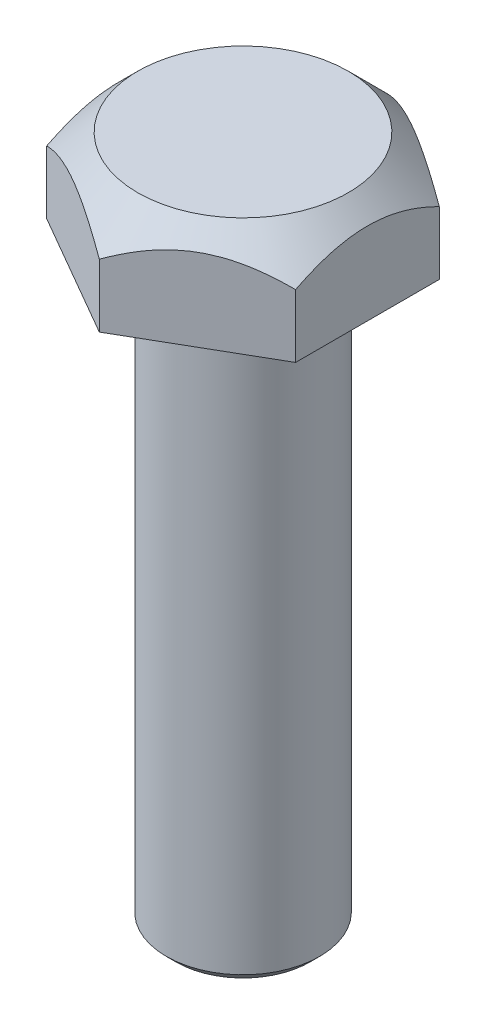
ISO-10303-21;
HEADER;
FILE_DESCRIPTION(('STEP AP214'),'2;1');
FILE_NAME('part.step','',(''),(''),'','','');
FILE_SCHEMA(('AUTOMOTIVE_DESIGN { 1 0 10303 214 1 1 1 1 }'));
ENDSEC;
DATA;
#1=APPLICATION_CONTEXT('core data for automotive mechanical design processes');
#2=APPLICATION_PROTOCOL_DEFINITION('international standard','automotive_design',2000,#1);
#3=PRODUCT_CONTEXT('',#1,'mechanical');
#4=PRODUCT('Part','Part','',(#3));
#5=PRODUCT_RELATED_PRODUCT_CATEGORY('part','',(#4));
#6=PRODUCT_DEFINITION_FORMATION('','',#4);
#7=PRODUCT_DEFINITION_CONTEXT('part definition',#1,'design');
#8=PRODUCT_DEFINITION('design','',#6,#7);
#9=PRODUCT_DEFINITION_SHAPE('','',#8);
#10=(LENGTH_UNIT() NAMED_UNIT(*) SI_UNIT(.MILLI.,.METRE.));
#11=(NAMED_UNIT(*) PLANE_ANGLE_UNIT() SI_UNIT($,.RADIAN.));
#12=(NAMED_UNIT(*) SI_UNIT($,.STERADIAN.) SOLID_ANGLE_UNIT());
#13=UNCERTAINTY_MEASURE_WITH_UNIT(LENGTH_MEASURE(1.E-05),#10,'distance_accuracy_value','');
#14=(GEOMETRIC_REPRESENTATION_CONTEXT(3) GLOBAL_UNCERTAINTY_ASSIGNED_CONTEXT((#13)) GLOBAL_UNIT_ASSIGNED_CONTEXT((#10,
#11,#12)) REPRESENTATION_CONTEXT('',''));
#15=CARTESIAN_POINT('',(0.,0.,0.));
#16=DIRECTION('',(0.,0.,1.));
#17=DIRECTION('',(1.,0.,0.));
#18=AXIS2_PLACEMENT_3D('',#15,#16,#17);
#19=CARTESIAN_POINT('',(6.49999999999999,5.3,-3.75277674973258));
#20=DIRECTION('',(-0.5,0.,0.866025403784439));
#21=DIRECTION('',(0.866025403784439,0.,0.5));
#22=AXIS2_PLACEMENT_3D('',#19,#20,#21);
#23=PLANE('',#22);
#24=DIRECTION('',(-0.866025403784439,0.,-0.5));
#25=VECTOR('',#24,1.);
#26=CARTESIAN_POINT('',(6.49999999999999,3.3,-3.75277674973258));
#27=LINE('',#26,#25);
#28=CARTESIAN_POINT('',(6.49999999999999,3.3,-3.75277674973258));
#29=VERTEX_POINT('',#28);
#30=CARTESIAN_POINT('',(6.49037034920394,3.3,-3.75833643121188));
#31=VERTEX_POINT('',#30);
#32=EDGE_CURVE('E234',#29,#31,#27,.T.);
#33=ORIENTED_EDGE('',*,*,#32,.F.);
#34=DIRECTION('',(0.,-1.,0.));
#35=VECTOR('',#34,1.);
#36=CARTESIAN_POINT('',(6.49999999999999,5.3,-3.75277674973258));
#37=LINE('',#36,#35);
#38=CARTESIAN_POINT('',(6.49999999999999,0.,-3.75277674973258));
#39=VERTEX_POINT('',#38);
#40=EDGE_CURVE('E70',#29,#39,#37,.T.);
#41=ORIENTED_EDGE('',*,*,#40,.T.);
#42=DIRECTION('',(-0.866025403784439,0.,-0.5));
#43=VECTOR('',#42,1.);
#44=CARTESIAN_POINT('',(6.49999999999999,0.,-3.75277674973258));
#45=LINE('',#44,#43);
#46=CARTESIAN_POINT('',(0.,0.,-7.50555349946514));
#47=VERTEX_POINT('',#46);
#48=EDGE_CURVE('E348',#39,#47,#45,.T.);
#49=ORIENTED_EDGE('',*,*,#48,.T.);
#50=DIRECTION('',(0.,-1.,0.));
#51=VECTOR('',#50,1.);
#52=CARTESIAN_POINT('',(0.,5.3,-7.50555349946514));
#53=LINE('',#52,#51);
#54=CARTESIAN_POINT('',(0.,3.3,-7.50555349946514));
#55=VERTEX_POINT('',#54);
#56=EDGE_CURVE('E268',#55,#47,#53,.T.);
#57=ORIENTED_EDGE('',*,*,#56,.F.);
#58=CARTESIAN_POINT('',(0.00962965079606432,3.3,-7.49999381798583));
#59=VERTEX_POINT('',#58);
#60=EDGE_CURVE('E240',#59,#55,#27,.T.);
#61=ORIENTED_EDGE('',*,*,#60,.F.);
#62=CARTESIAN_POINT('',(7.87859050212728,2.38482719239565,-2.95684715222713));
#63=CARTESIAN_POINT('',(7.76706188172145,2.46661049672398,-3.02123823124078));
#64=CARTESIAN_POINT('',(7.65485075902602,2.54714950388906,-3.08602335313506));
#65=CARTESIAN_POINT('',(7.4289190079416,2.70532862831204,-3.21646511044213));
#66=CARTESIAN_POINT('',(7.31519848792385,2.78296895217884,-3.28212168328677));
#67=CARTESIAN_POINT('',(6.96764440813013,3.01352277613167,-3.48278212481362));
#68=CARTESIAN_POINT('',(6.73119170530991,3.16126448608666,-3.61929815643749));
#69=CARTESIAN_POINT('',(6.26749228304814,3.4283985116646,-3.88701514270339));
#70=CARTESIAN_POINT('',(6.0408017863967,3.54906416199081,-4.01789496196784));
#71=CARTESIAN_POINT('',(5.5797470280982,3.76947839077262,-4.28408505078263));
#72=CARTESIAN_POINT('',(5.34538124006423,3.86922277904763,-4.41939620159288));
#73=CARTESIAN_POINT('',(4.87145432653839,4.04064173992743,-4.69301803269324));
#74=CARTESIAN_POINT('',(4.63197063508101,4.11259239904096,-4.83128400642268));
#75=CARTESIAN_POINT('',(4.26864116478208,4.19585996592496,-5.04105237390429));
#76=CARTESIAN_POINT('',(4.14687391071214,4.21950365542397,-5.11135473082005));
#77=CARTESIAN_POINT('',(3.90230940140931,4.25799816105839,-5.25255411610027));
#78=CARTESIAN_POINT('',(3.77951229401264,4.27285021804765,-5.32345105911145));
#79=CARTESIAN_POINT('',(3.4803623254977,4.29771341984846,-5.49616537396161));
#80=CARTESIAN_POINT('',(3.30368910804302,4.30289566560559,-5.59816770361767));
#81=CARTESIAN_POINT('',(2.95073220429909,4.29401193844653,-5.80194746700657));
#82=CARTESIAN_POINT('',(2.77444850583605,4.27994657585519,-5.90372490776794));
#83=CARTESIAN_POINT('',(2.42322511749118,4.2333653464685,-6.10650382557455));
#84=CARTESIAN_POINT('',(2.24829087330646,4.20079558392678,-6.20750215854508));
#85=CARTESIAN_POINT('',(1.90140765433712,4.11894754076407,-6.40777527839439));
#86=CARTESIAN_POINT('',(1.72945888130527,4.06966813551974,-6.50704994879115));
#87=CARTESIAN_POINT('',(1.42558712262901,3.96874320102445,-6.68249039046202));
#88=CARTESIAN_POINT('',(1.29296417353277,3.91985451992157,-6.75906028582346));
#89=CARTESIAN_POINT('',(1.03010012369256,3.81427409930991,-6.91082491575897));
#90=CARTESIAN_POINT('',(0.899858673807147,3.75758351416576,-6.98601985190996));
#91=CARTESIAN_POINT('',(0.641557674230804,3.63736800390099,-7.13515000354731));
#92=CARTESIAN_POINT('',(0.513501570267234,3.57383326697322,-7.20908322964206));
#93=CARTESIAN_POINT('',(0.259701122506278,3.44095927885765,-7.35561498647729));
#94=CARTESIAN_POINT('',(0.133956497641463,3.37162073916188,-7.42821367949214));
#95=CARTESIAN_POINT('',(-0.248658240253918,3.15120854502064,-7.64911640141196));
#96=CARTESIAN_POINT('',(-0.502016288328589,2.99199219600555,-7.79539273866923));
#97=CARTESIAN_POINT('',(-1.0010410979481,2.65813100038424,-8.08350484683535));
#98=CARTESIAN_POINT('',(-1.24670345427796,2.48347752810631,-8.22533807439216));
#99=CARTESIAN_POINT('',(-1.73238461132814,2.12228382468745,-8.50574622115541));
#100=CARTESIAN_POINT('',(-1.97238438779757,1.93570968404689,-8.64431015670548));
#101=CARTESIAN_POINT('',(-2.44713736806989,1.55403703730479,-8.91840891766428));
#102=CARTESIAN_POINT('',(-2.68189166242562,1.35894032847224,-9.05394437270398));
#103=CARTESIAN_POINT('',(-3.1402915373258,0.968067313273014,-9.31860166387409));
#104=CARTESIAN_POINT('',(-3.36406012949311,0.77248260098705,-9.44779452079807));
#105=CARTESIAN_POINT('',(-3.8083569263861,0.376437944379171,-9.70430939608432));
#106=CARTESIAN_POINT('',(-4.02888487673237,0.175977620583029,-9.83163126758058));
#107=CARTESIAN_POINT('',(-4.46569331792664,-0.227378651399945,-10.0838227386884));
#108=CARTESIAN_POINT('',(-4.6819928551962,-0.430247171716959,-10.2087033347566));
#109=CARTESIAN_POINT('',(-5.1123183073564,-0.839079480185495,-10.4571518504004));
#110=CARTESIAN_POINT('',(-5.32634465569715,-1.04504265948351,-10.5807200202286));
#111=CARTESIAN_POINT('',(-5.53946545545758,-1.25223094107099,-10.7037653713402));
#112=B_SPLINE_CURVE_WITH_KNOTS('',3,(#62,#63,#64,#65,#66,#67,#68,#69,#70,#71,#72,#73,#74,#75,
#76,#77,#78,#79,#80,#81,#82,#83,#84,#85,#86,#87,#88,#89,#90,#91,#92,#93,#94,#95,#96,#97,#98,#99,
#100,#101,#102,#103,#104,#105,#106,#107,#108,#109,#110,#111),.UNSPECIFIED.,.F.,.F.,(4,2,2,2,2,2,
2,2,2,2,2,2,2,2,2,2,2,2,2,2,2,2,2,2,4),(0.,0.457652243937184,0.915271805360474,1.84604121161983,
2.71004753726698,3.5742267441126,4.42958628441118,4.85708270224485,5.28451876869987,
5.89578052813593,6.50702290544435,7.12005477597816,7.73312791411144,8.21516819893579,
8.69713723792104,9.17980666440785,9.66241700654952,10.6608998092018,11.6599440959741,
12.6619690307027,13.6637836654881,14.6359002132873,15.6080926656503,16.5733770805861,
17.5384740063964),.UNSPECIFIED.);
#113=EDGE_CURVE('E217',#31,#59,#112,.T.);
#114=ORIENTED_EDGE('',*,*,#113,.F.);
#115=EDGE_LOOP('',(#33,#41,#49,#57,#61,#114));
#116=FACE_BOUND('',#115,.T.);
#117=ADVANCED_FACE('F46',(#116),#23,.F.);
#118=CARTESIAN_POINT('',(0.,5.3,-7.50555349946514));
#119=DIRECTION('',(0.499999999999999,0.,0.866025403784439));
#120=DIRECTION('',(0.866025403784439,0.,-0.5));
#121=AXIS2_PLACEMENT_3D('',#118,#119,#120);
#122=PLANE('',#121);
#123=DIRECTION('',(-0.866025403784439,0.,0.5));
#124=VECTOR('',#123,1.);
#125=CARTESIAN_POINT('',(0.,3.3,-7.50555349946514));
#126=LINE('',#125,#124);
#127=CARTESIAN_POINT('',(-0.00962965079605695,3.3,-7.49999381798583));
#128=VERTEX_POINT('',#127);
#129=EDGE_CURVE('E358',#55,#128,#126,.T.);
#130=ORIENTED_EDGE('',*,*,#129,.F.);
#131=ORIENTED_EDGE('',*,*,#56,.T.);
#132=DIRECTION('',(-0.866025403784439,0.,0.499999999999999));
#133=VECTOR('',#132,1.);
#134=CARTESIAN_POINT('',(0.,0.,-7.50555349946514));
#135=LINE('',#134,#133);
#136=CARTESIAN_POINT('',(-6.50000000000001,0.,-3.75277674973257));
#137=VERTEX_POINT('',#136);
#138=EDGE_CURVE('E338',#47,#137,#135,.T.);
#139=ORIENTED_EDGE('',*,*,#138,.T.);
#140=DIRECTION('',(0.,-1.,0.));
#141=VECTOR('',#140,1.);
#142=CARTESIAN_POINT('',(-6.50000000000001,5.3,-3.75277674973257));
#143=LINE('',#142,#141);
#144=CARTESIAN_POINT('',(-6.50000000000001,3.3,-3.75277674973257));
#145=VERTEX_POINT('',#144);
#146=EDGE_CURVE('E265',#145,#137,#143,.T.);
#147=ORIENTED_EDGE('',*,*,#146,.F.);
#148=CARTESIAN_POINT('',(-6.49037034920394,3.3,-3.75833643121188));
#149=VERTEX_POINT('',#148);
#150=EDGE_CURVE('E355',#149,#145,#126,.T.);
#151=ORIENTED_EDGE('',*,*,#150,.F.);
#152=CARTESIAN_POINT('',(-0.00927253307189294,3.29979426816373,-7.50020000000001));
#153=CARTESIAN_POINT('',(-0.120750501605697,3.36400866460032,-7.4358381648583));
#154=CARTESIAN_POINT('',(-0.233083949194142,3.42624691709814,-7.37098241865412));
#155=CARTESIAN_POINT('',(-0.459628235751576,3.54617220569595,-7.24018701382681));
#156=CARTESIAN_POINT('',(-0.573840054623125,3.60385676896834,-7.17424678945669));
#157=CARTESIAN_POINT('',(-0.920593559916916,3.76966858137436,-6.97404855983287));
#158=CARTESIAN_POINT('',(-1.15606222562941,3.86985264179211,-6.83810066229804));
#159=CARTESIAN_POINT('',(-1.63089677624584,4.04138534573599,-6.56395480667911));
#160=CARTESIAN_POINT('',(-1.87014264057005,4.11316381336499,-6.42582614250902));
#161=CARTESIAN_POINT('',(-2.23292377434851,4.19617453310339,-6.21637435726511));
#162=CARTESIAN_POINT('',(-2.35438264203635,4.21972429684704,-6.14625004731007));
#163=CARTESIAN_POINT('',(-2.59832257031578,4.25807460945137,-6.00541126405184));
#164=CARTESIAN_POINT('',(-2.72080347731361,4.27287644977813,-5.93469687942605));
#165=CARTESIAN_POINT('',(-3.01975184160379,4.29772292697089,-5.76209896082932));
#166=CARTESIAN_POINT('',(-3.19654224259405,4.30290241776892,-5.66002897522745));
#167=CARTESIAN_POINT('',(-3.54979918344675,4.2939859505684,-5.45607598533305));
#168=CARTESIAN_POINT('',(-3.72626558865334,4.2798832607106,-5.35419305878409));
#169=CARTESIAN_POINT('',(-4.07752897663277,4.23323372907824,-5.15139104717771));
#170=CARTESIAN_POINT('',(-4.25232389349506,4.20066647252683,-5.05047315487429));
#171=CARTESIAN_POINT('',(-4.59890742006691,4.11885719601682,-4.85037306251134));
#172=CARTESIAN_POINT('',(-4.770696260992,4.06961646449786,-4.75119072895947));
#173=CARTESIAN_POINT('',(-5.07471351503861,3.96864346353789,-4.57566628549736));
#174=CARTESIAN_POINT('',(-5.2076333942828,3.91963450250975,-4.49892495743508));
#175=CARTESIAN_POINT('',(-5.47110364654848,3.81377046935868,-4.34681033636603));
#176=CARTESIAN_POINT('',(-5.60165396634784,3.75691522124823,-4.27143707408708));
#177=CARTESIAN_POINT('',(-5.85997228331789,3.63661981762543,-4.12229692424781));
#178=CARTESIAN_POINT('',(-5.98774760687758,3.57320046646217,-4.04852580679483));
#179=CARTESIAN_POINT('',(-6.24094953922459,3.44059733535143,-3.90233960299495));
#180=CARTESIAN_POINT('',(-6.36637748997797,3.37141698036078,-3.82992374186358));
#181=CARTESIAN_POINT('',(-6.49071751777288,3.2998,-3.75813599334515));
#182=B_SPLINE_CURVE_WITH_KNOTS('',3,(#152,#153,#154,#155,#156,#157,#158,#159,#160,#161,#162,
#163,#164,#165,#166,#167,#168,#169,#170,#171,#172,#173,#174,#175,#176,#177,#178,#179,#180,#181),
.UNSPECIFIED.,.F.,.F.,(4,2,2,2,2,2,2,2,2,2,2,2,2,2,4),(0.,0.431529395924087,0.86329153947423,
1.73143564290169,2.58588895682851,3.01228556199099,3.43861920199326,4.0502842703159,
4.66216293972477,5.27471943677468,5.88722860943442,6.37035767098806,6.85349757059865,
7.33515055003088,7.81651920015923),.UNSPECIFIED.);
#183=EDGE_CURVE('E210',#128,#149,#182,.T.);
#184=ORIENTED_EDGE('',*,*,#183,.F.);
#185=EDGE_LOOP('',(#130,#131,#139,#147,#151,#184));
#186=FACE_BOUND('',#185,.T.);
#187=ADVANCED_FACE('F223',(#186),#122,.F.);
#188=CARTESIAN_POINT('',(-6.50000000000001,5.3,-3.75277674973257));
#189=DIRECTION('',(1.,0.,0.));
#190=DIRECTION('',(0.,0.,-1.));
#191=AXIS2_PLACEMENT_3D('',#188,#189,#190);
#192=PLANE('',#191);
#193=DIRECTION('',(0.,0.,1.));
#194=VECTOR('',#193,1.);
#195=CARTESIAN_POINT('',(-6.50000000000001,3.3,-3.75277674973257));
#196=LINE('',#195,#194);
#197=CARTESIAN_POINT('',(-6.50000000000001,3.3,-3.74165738677395));
#198=VERTEX_POINT('',#197);
#199=EDGE_CURVE('E359',#145,#198,#196,.T.);
#200=ORIENTED_EDGE('',*,*,#199,.F.);
#201=ORIENTED_EDGE('',*,*,#146,.T.);
#202=DIRECTION('',(0.,0.,1.));
#203=VECTOR('',#202,1.);
#204=CARTESIAN_POINT('',(-6.50000000000001,0.,-3.75277674973257));
#205=LINE('',#204,#203);
#206=CARTESIAN_POINT('',(-6.50000000000001,0.,3.75277674973256));
#207=VERTEX_POINT('',#206);
#208=EDGE_CURVE('E330',#137,#207,#205,.T.);
#209=ORIENTED_EDGE('',*,*,#208,.T.);
#210=DIRECTION('',(0.,-1.,0.));
#211=VECTOR('',#210,1.);
#212=CARTESIAN_POINT('',(-6.50000000000001,5.3,3.75277674973256));
#213=LINE('',#212,#211);
#214=CARTESIAN_POINT('',(-6.50000000000001,3.3,3.75277674973256));
#215=VERTEX_POINT('',#214);
#216=EDGE_CURVE('E262',#215,#207,#213,.T.);
#217=ORIENTED_EDGE('',*,*,#216,.F.);
#218=CARTESIAN_POINT('',(-6.50000000000001,3.3,3.74165738677394));
#219=VERTEX_POINT('',#218);
#220=EDGE_CURVE('E324',#219,#215,#196,.T.);
#221=ORIENTED_EDGE('',*,*,#220,.F.);
#222=CARTESIAN_POINT('',(-6.5,-2.42763441950492,-11.5204302148866));
#223=CARTESIAN_POINT('',(-6.5,-2.27972914251504,-11.3506027684386));
#224=CARTESIAN_POINT('',(-6.5,-2.13226853163712,-11.1803883449719));
#225=CARTESIAN_POINT('',(-6.5,-1.83836083209446,-10.8390822676103));
#226=CARTESIAN_POINT('',(-6.5,-1.69191375939568,-10.6679905999699));
#227=CARTESIAN_POINT('',(-6.5,-1.25415485539874,-10.1530984703283));
#228=CARTESIAN_POINT('',(-6.5,-0.964558634189009,-9.80783349108382));
#229=CARTESIAN_POINT('',(-6.5,-0.385111979438174,-9.10479193601526));
#230=CARTESIAN_POINT('',(-6.5,-0.0953932318678669,-8.74690660924928));
#231=CARTESIAN_POINT('',(-6.5,0.475565175448003,-8.02453050090004));
#232=CARTESIAN_POINT('',(-6.50000000000001,0.756806923061162,-7.66004138181869));
#233=CARTESIAN_POINT('',(-6.50000000000001,1.16999794853931,-7.10647056704998));
#234=CARTESIAN_POINT('',(-6.50000000000001,1.30636676362715,-6.92068742655644));
#235=CARTESIAN_POINT('',(-6.50000000000001,1.57554428746486,-6.54656373680408));
#236=CARTESIAN_POINT('',(-6.50000000000001,1.70835313459436,-6.35822328738049));
#237=CARTESIAN_POINT('',(-6.50000000000001,1.96979777691429,-5.97841623931841));
#238=CARTESIAN_POINT('',(-6.50000000000001,2.09842980822761,-5.78694704265935));
#239=CARTESIAN_POINT('',(-6.50000000000001,2.35045269483453,-5.40058313133201));
#240=CARTESIAN_POINT('',(-6.50000000000001,2.47384366391409,-5.20568849116177));
#241=CARTESIAN_POINT('',(-6.50000000000001,2.71334202813457,-4.81331717915114));
#242=CARTESIAN_POINT('',(-6.50000000000001,2.82949416259811,-4.61586794105344));
#243=CARTESIAN_POINT('',(-6.50000000000001,3.0539353801595,-4.21649227245568));
#244=CARTESIAN_POINT('',(-6.50000000000001,3.16222351350154,-4.0145653050001));
#245=CARTESIAN_POINT('',(-6.50000000000001,3.36883255754831,-3.60600365027988));
#246=CARTESIAN_POINT('',(-6.50000000000001,3.46716767949426,-3.39937620632762));
#247=CARTESIAN_POINT('',(-6.50000000000001,3.65159395508309,-2.9807699213617));
#248=CARTESIAN_POINT('',(-6.50000000000001,3.73768980402625,-2.7687931694284));
#249=CARTESIAN_POINT('',(-6.50000000000001,3.89655087634342,-2.33438744664161));
#250=CARTESIAN_POINT('',(-6.50000000000001,3.96897114454902,-2.1118305396776));
#251=CARTESIAN_POINT('',(-6.50000000000001,4.09454301839562,-1.66129135650394));
#252=CARTESIAN_POINT('',(-6.50000000000001,4.1476976836222,-1.43330994789739));
#253=CARTESIAN_POINT('',(-6.50000000000001,4.23116374101529,-0.974699283919986));
#254=CARTESIAN_POINT('',(-6.50000000000001,4.26162587810811,-0.744098024111797));
#255=CARTESIAN_POINT('',(-6.50000000000001,4.29802401893021,-0.280953595381539));
#256=CARTESIAN_POINT('',(-6.50000000000001,4.30396322163408,-0.0484106837105108));
#257=CARTESIAN_POINT('',(-6.50000000000001,4.29082652170368,0.416506051709944));
#258=CARTESIAN_POINT('',(-6.50000000000001,4.27169098626911,0.64887815259206));
#259=CARTESIAN_POINT('',(-6.50000000000001,4.20980383718694,1.1104336728228));
#260=CARTESIAN_POINT('',(-6.50000000000001,4.16704729817804,1.33961641691772));
#261=CARTESIAN_POINT('',(-6.50000000000001,4.06043719245902,1.79473754817043));
#262=CARTESIAN_POINT('',(-6.50000000000001,3.99642836459948,2.02063889436049));
#263=CARTESIAN_POINT('',(-6.50000000000001,3.85090952957997,2.4666448070182));
#264=CARTESIAN_POINT('',(-6.50000000000001,3.76939901470241,2.68674920511048));
#265=CARTESIAN_POINT('',(-6.50000000000001,3.57466415867344,3.16417381375506));
#266=CARTESIAN_POINT('',(-6.50000000000001,3.4583561236568,3.42022467635594));
#267=CARTESIAN_POINT('',(-6.50000000000001,3.21018417963608,3.92473881636486));
#268=CARTESIAN_POINT('',(-6.50000000000001,3.07831144059492,4.17319768515907));
#269=CARTESIAN_POINT('',(-6.50000000000001,2.80245152505909,4.66390665134327));
#270=CARTESIAN_POINT('',(-6.50000000000001,2.65844024125288,4.90614308461888));
#271=CARTESIAN_POINT('',(-6.50000000000001,2.36130885517446,5.3848588121431));
#272=CARTESIAN_POINT('',(-6.50000000000001,2.2081905287032,5.62133921618056));
#273=CARTESIAN_POINT('',(-6.50000000000001,1.89398088769268,6.09079149831678));
#274=CARTESIAN_POINT('',(-6.50000000000001,1.73285060892363,6.32373717346791));
#275=CARTESIAN_POINT('',(-6.50000000000001,1.40490566656175,6.78558940510256));
#276=CARTESIAN_POINT('',(-6.50000000000001,1.23809080320757,7.01449581921294));
#277=CARTESIAN_POINT('',(-6.50000000000001,0.9001110329331,7.4686525907656));
#278=CARTESIAN_POINT('',(-6.50000000000001,0.728951395510349,7.69390688054484));
#279=CARTESIAN_POINT('',(-6.50000000000001,0.382947068998701,8.14156925783594));
#280=CARTESIAN_POINT('',(-6.50000000000001,0.208102293961706,8.3639772787697));
#281=CARTESIAN_POINT('',(-6.50000000000001,-0.168393939926925,8.83621175271251));
#282=CARTESIAN_POINT('',(-6.50000000000001,-0.37048055961676,9.08569079478646));
#283=CARTESIAN_POINT('',(-6.50000000000001,-0.777810158180145,9.58205493365614));
#284=CARTESIAN_POINT('',(-6.50000000000001,-0.983053144993547,9.82894002392415));
#285=CARTESIAN_POINT('',(-6.50000000000001,-1.39369633828433,10.3176357987389));
#286=CARTESIAN_POINT('',(-6.50000000000002,-1.59906622307845,10.5594720016602));
#287=CARTESIAN_POINT('',(-6.50000000000002,-2.01188238942979,11.041267106789));
#288=CARTESIAN_POINT('',(-6.50000000000002,-2.21932816659515,11.2812264409415));
#289=CARTESIAN_POINT('',(-6.50000000000002,-2.42763441950493,11.5204302148866));
#290=B_SPLINE_CURVE_WITH_KNOTS('',3,(#222,#223,#224,#225,#226,#227,#228,#229,#230,#231,#232,
#233,#234,#235,#236,#237,#238,#239,#240,#241,#242,#243,#244,#245,#246,#247,#248,#249,#250,#251,
#252,#253,#254,#255,#256,#257,#258,#259,#260,#261,#262,#263,#264,#265,#266,#267,#268,#269,#270,
#271,#272,#273,#274,#275,#276,#277,#278,#279,#280,#281,#282,#283,#284,#285,#286,#287,#288,#289),
.UNSPECIFIED.,.F.,.F.,(4,2,2,2,2,2,2,2,2,2,2,2,2,2,2,2,2,2,2,2,2,2,2,2,2,2,2,2,2,2,2,2,2,4),(0.,
0.675613534955519,1.35123768853246,2.70309383380994,4.08437671362673,5.46531655924323,
6.15666405954632,6.84798464737391,7.53991183142099,8.2318239857118,8.91891758393081,
9.60609402669623,10.2922750285952,10.9781920792928,11.6795992531649,12.3808949871525,
13.077489469463,13.773993079351,14.4721561257522,15.1704648054178,15.8739916328912,
16.5775388721807,17.4205166316569,18.2639749418763,19.1091497295347,19.9541602517095,
20.803784050862,21.6534377374014,22.5021060084531,23.3507940948616,24.3139382673786,
25.277084863084,26.2288878308685,27.1804648927828),.UNSPECIFIED.);
#291=EDGE_CURVE('E167',#198,#219,#290,.T.);
#292=ORIENTED_EDGE('',*,*,#291,.F.);
#293=EDGE_LOOP('',(#200,#201,#209,#217,#221,#292));
#294=FACE_BOUND('',#293,.T.);
#295=ADVANCED_FACE('F226',(#294),#192,.F.);
#296=CARTESIAN_POINT('',(-6.50000000000001,5.3,3.75277674973256));
#297=DIRECTION('',(0.5,0.,-0.866025403784438));
#298=DIRECTION('',(-0.866025403784438,0.,-0.5));
#299=AXIS2_PLACEMENT_3D('',#296,#297,#298);
#300=PLANE('',#299);
#301=DIRECTION('',(0.866025403784438,0.,0.5));
#302=VECTOR('',#301,1.);
#303=CARTESIAN_POINT('',(-6.50000000000001,3.3,3.75277674973256));
#304=LINE('',#303,#302);
#305=CARTESIAN_POINT('',(-6.49037034920394,3.3,3.75833643121188));
#306=VERTEX_POINT('',#305);
#307=EDGE_CURVE('E317',#215,#306,#304,.T.);
#308=ORIENTED_EDGE('',*,*,#307,.F.);
#309=ORIENTED_EDGE('',*,*,#216,.T.);
#310=DIRECTION('',(0.866025403784438,0.,0.5));
#311=VECTOR('',#310,1.);
#312=CARTESIAN_POINT('',(-6.50000000000001,0.,3.75277674973256));
#313=LINE('',#312,#311);
#314=CARTESIAN_POINT('',(0.,0.,7.50555349946513));
#315=VERTEX_POINT('',#314);
#316=EDGE_CURVE('E337',#207,#315,#313,.T.);
#317=ORIENTED_EDGE('',*,*,#316,.T.);
#318=DIRECTION('',(0.,-1.,0.));
#319=VECTOR('',#318,1.);
#320=CARTESIAN_POINT('',(0.,5.3,7.50555349946513));
#321=LINE('',#320,#319);
#322=CARTESIAN_POINT('',(0.,3.3,7.50555349946513));
#323=VERTEX_POINT('',#322);
#324=EDGE_CURVE('E254',#323,#315,#321,.T.);
#325=ORIENTED_EDGE('',*,*,#324,.F.);
#326=CARTESIAN_POINT('',(-0.00962965079606562,3.3,7.49999381798583));
#327=VERTEX_POINT('',#326);
#328=EDGE_CURVE('E143',#327,#323,#304,.T.);
#329=ORIENTED_EDGE('',*,*,#328,.F.);
#330=CARTESIAN_POINT('',(-7.87859050212729,2.38482719239564,2.95684715222712));
#331=CARTESIAN_POINT('',(-7.76706188172146,2.46661049672398,3.02123823124077));
#332=CARTESIAN_POINT('',(-7.65485075902602,2.54714950388906,3.08602335313505));
#333=CARTESIAN_POINT('',(-7.42891900794161,2.70532862831203,3.21646511044212));
#334=CARTESIAN_POINT('',(-7.31519848792386,2.78296895217884,3.28212168328676));
#335=CARTESIAN_POINT('',(-6.96764440813014,3.01352277613167,3.48278212481361));
#336=CARTESIAN_POINT('',(-6.73119170530992,3.16126448608666,3.61929815643748));
#337=CARTESIAN_POINT('',(-6.26749228304815,3.4283985116646,3.88701514270339));
#338=CARTESIAN_POINT('',(-6.0408017863967,3.54906416199081,4.01789496196783));
#339=CARTESIAN_POINT('',(-5.57974702809821,3.76947839077262,4.28408505078262));
#340=CARTESIAN_POINT('',(-5.34538124006424,3.86922277904763,4.41939620159287));
#341=CARTESIAN_POINT('',(-4.8714543265384,4.04064173992743,4.69301803269323));
#342=CARTESIAN_POINT('',(-4.63197063508101,4.11259239904096,4.83128400642268));
#343=CARTESIAN_POINT('',(-4.26864116478209,4.19585996592495,5.04105237390428));
#344=CARTESIAN_POINT('',(-4.14687391071214,4.21950365542397,5.11135473082005));
#345=CARTESIAN_POINT('',(-3.90230940140931,4.25799816105839,5.25255411610026));
#346=CARTESIAN_POINT('',(-3.77951229401264,4.27285021804765,5.32345105911144));
#347=CARTESIAN_POINT('',(-3.4803623254977,4.29771341984846,5.49616537396161));
#348=CARTESIAN_POINT('',(-3.30368910804302,4.3028956656056,5.59816770361767));
#349=CARTESIAN_POINT('',(-2.95073220429909,4.29401193844653,5.80194746700656));
#350=CARTESIAN_POINT('',(-2.77444850583606,4.27994657585519,5.90372490776794));
#351=CARTESIAN_POINT('',(-2.42322511749119,4.2333653464685,6.10650382557454));
#352=CARTESIAN_POINT('',(-2.24829087330646,4.20079558392678,6.20750215854508));
#353=CARTESIAN_POINT('',(-1.90140765433713,4.11894754076408,6.40777527839439));
#354=CARTESIAN_POINT('',(-1.72945888130528,4.06966813551974,6.50704994879115));
#355=CARTESIAN_POINT('',(-1.42558712262902,3.96874320102445,6.68249039046201));
#356=CARTESIAN_POINT('',(-1.29296417353278,3.91985451992157,6.75906028582345));
#357=CARTESIAN_POINT('',(-1.03010012369257,3.81427409930991,6.91082491575897));
#358=CARTESIAN_POINT('',(-0.899858673807153,3.75758351416577,6.98601985190996));
#359=CARTESIAN_POINT('',(-0.641557674230809,3.637368003901,7.13515000354731));
#360=CARTESIAN_POINT('',(-0.513501570267238,3.57383326697322,7.20908322964206));
#361=CARTESIAN_POINT('',(-0.259701122506283,3.44095927885765,7.35561498647729));
#362=CARTESIAN_POINT('',(-0.133956497641467,3.37162073916188,7.42821367949214));
#363=CARTESIAN_POINT('',(0.248658240253916,3.15120854502064,7.64911640141196));
#364=CARTESIAN_POINT('',(0.502016288328587,2.99199219600555,7.79539273866923));
#365=CARTESIAN_POINT('',(1.0010410979481,2.65813100038424,8.08350484683536));
#366=CARTESIAN_POINT('',(1.24670345427796,2.4834775281063,8.22533807439216));
#367=CARTESIAN_POINT('',(1.73238461132814,2.12228382468745,8.50574622115541));
#368=CARTESIAN_POINT('',(1.97238438779757,1.93570968404688,8.64431015670548));
#369=CARTESIAN_POINT('',(2.44713736806989,1.55403703730478,8.91840891766429));
#370=CARTESIAN_POINT('',(2.68189166242562,1.35894032847223,9.05394437270399));
#371=CARTESIAN_POINT('',(3.14029153732581,0.968067313273007,9.3186016638741));
#372=CARTESIAN_POINT('',(3.36406012949312,0.772482600987041,9.44779452079808));
#373=CARTESIAN_POINT('',(3.8083569263861,0.376437944379163,9.70430939608433));
#374=CARTESIAN_POINT('',(4.02888487673237,0.175977620583021,9.83163126758059));
#375=CARTESIAN_POINT('',(4.46569331792665,-0.227378651399953,10.0838227386884));
#376=CARTESIAN_POINT('',(4.6819928551962,-0.430247171716967,10.2087033347566));
#377=CARTESIAN_POINT('',(5.1123183073564,-0.839079480185504,10.4571518504004));
#378=CARTESIAN_POINT('',(5.32634465569715,-1.04504265948352,10.5807200202286));
#379=CARTESIAN_POINT('',(5.53946545545758,-1.252230941071,10.7037653713402));
#380=B_SPLINE_CURVE_WITH_KNOTS('',3,(#330,#331,#332,#333,#334,#335,#336,#337,#338,#339,#340,
#341,#342,#343,#344,#345,#346,#347,#348,#349,#350,#351,#352,#353,#354,#355,#356,#357,#358,#359,
#360,#361,#362,#363,#364,#365,#366,#367,#368,#369,#370,#371,#372,#373,#374,#375,#376,#377,#378,
#379),.UNSPECIFIED.,.F.,.F.,(4,2,2,2,2,2,2,2,2,2,2,2,2,2,2,2,2,2,2,2,2,2,2,2,4),(0.,
0.457652243937184,0.915271805360474,1.84604121161984,2.71004753726698,3.5742267441126,
4.42958628441118,4.85708270224486,5.28451876869988,5.89578052813593,6.50702290544435,
7.12005477597817,7.73312791411144,8.21516819893579,8.69713723792105,9.17980666440786,
9.66241700654953,10.6608998092018,11.6599440959741,12.6619690307028,13.6637836654881,
14.6359002132873,15.6080926656503,16.5733770805862,17.5384740063964),.UNSPECIFIED.);
#381=EDGE_CURVE('E154',#306,#327,#380,.T.);
#382=ORIENTED_EDGE('',*,*,#381,.F.);
#383=EDGE_LOOP('',(#308,#309,#317,#325,#329,#382));
#384=FACE_BOUND('',#383,.T.);
#385=ADVANCED_FACE('F306',(#384),#300,.F.);
#386=CARTESIAN_POINT('',(0.,5.3,7.50555349946513));
#387=DIRECTION('',(-0.5,0.,-0.866025403784439));
#388=DIRECTION('',(-0.866025403784439,0.,0.5));
#389=AXIS2_PLACEMENT_3D('',#386,#387,#388);
#390=PLANE('',#389);
#391=DIRECTION('',(0.866025403784439,0.,-0.5));
#392=VECTOR('',#391,1.);
#393=CARTESIAN_POINT('',(0.,3.3,7.50555349946513));
#394=LINE('',#393,#392);
#395=CARTESIAN_POINT('',(0.00962965079602486,3.3,7.49999381798583));
#396=VERTEX_POINT('',#395);
#397=EDGE_CURVE('E138',#323,#396,#394,.T.);
#398=ORIENTED_EDGE('',*,*,#397,.F.);
#399=ORIENTED_EDGE('',*,*,#324,.T.);
#400=DIRECTION('',(0.866025403784438,0.,-0.5));
#401=VECTOR('',#400,1.);
#402=CARTESIAN_POINT('',(0.,0.,7.50555349946513));
#403=LINE('',#402,#401);
#404=CARTESIAN_POINT('',(6.49999999999999,0.,3.75277674973255));
#405=VERTEX_POINT('',#404);
#406=EDGE_CURVE('E256',#315,#405,#403,.T.);
#407=ORIENTED_EDGE('',*,*,#406,.T.);
#408=DIRECTION('',(0.,-1.,0.));
#409=VECTOR('',#408,1.);
#410=CARTESIAN_POINT('',(6.49999999999999,5.3,3.75277674973255));
#411=LINE('',#410,#409);
#412=CARTESIAN_POINT('',(6.49999999999999,3.3,3.75277674973255));
#413=VERTEX_POINT('',#412);
#414=EDGE_CURVE('E250',#413,#405,#411,.T.);
#415=ORIENTED_EDGE('',*,*,#414,.F.);
#416=CARTESIAN_POINT('',(6.49037034920396,3.3,3.75833643121184));
#417=VERTEX_POINT('',#416);
#418=EDGE_CURVE('E148',#417,#413,#394,.T.);
#419=ORIENTED_EDGE('',*,*,#418,.F.);
#420=CARTESIAN_POINT('',(0.00927253307186149,3.29979426816373,7.50020000000001));
#421=CARTESIAN_POINT('',(0.120750501605667,3.36400866460032,7.4358381648583));
#422=CARTESIAN_POINT('',(0.233083949194113,3.42624691709814,7.37098241865412));
#423=CARTESIAN_POINT('',(0.459628235751548,3.54617220569596,7.24018701382681));
#424=CARTESIAN_POINT('',(0.573840054623097,3.60385676896834,7.17424678945668));
#425=CARTESIAN_POINT('',(0.920593559916891,3.76966858137437,6.97404855983286));
#426=CARTESIAN_POINT('',(1.15606222562939,3.86985264179212,6.83810066229803));
#427=CARTESIAN_POINT('',(1.63089677624583,4.041385345736,6.5639548066791));
#428=CARTESIAN_POINT('',(1.87014264057004,4.11316381336501,6.42582614250901));
#429=CARTESIAN_POINT('',(2.23292377434849,4.1961745331034,6.2163743572651));
#430=CARTESIAN_POINT('',(2.35438264203634,4.21972429684705,6.14625004731005));
#431=CARTESIAN_POINT('',(2.59832257031577,4.25807460945139,6.00541126405182));
#432=CARTESIAN_POINT('',(2.7208034773136,4.27287644977815,5.93469687942604));
#433=CARTESIAN_POINT('',(3.01975184160377,4.29772292697091,5.76209896082931));
#434=CARTESIAN_POINT('',(3.19654224259404,4.30290241776893,5.66002897522744));
#435=CARTESIAN_POINT('',(3.54979918344673,4.29398595056842,5.45607598533303));
#436=CARTESIAN_POINT('',(3.72626558865333,4.27988326071062,5.35419305878408));
#437=CARTESIAN_POINT('',(4.07752897663275,4.23323372907826,5.1513910471777));
#438=CARTESIAN_POINT('',(4.25232389349505,4.20066647252685,5.05047315487427));
#439=CARTESIAN_POINT('',(4.5989074200669,4.11885719601684,4.85037306251132));
#440=CARTESIAN_POINT('',(4.77069626099199,4.06961646449789,4.75119072895945));
#441=CARTESIAN_POINT('',(5.0747135150386,3.96864346353791,4.57566628549734));
#442=CARTESIAN_POINT('',(5.20763339428279,3.91963450250977,4.49892495743506));
#443=CARTESIAN_POINT('',(5.47110364654848,3.8137704693587,4.34681033636601));
#444=CARTESIAN_POINT('',(5.60165396634784,3.75691522124824,4.27143707408705));
#445=CARTESIAN_POINT('',(5.8599722833179,3.63661981762544,4.12229692424778));
#446=CARTESIAN_POINT('',(5.98774760687759,3.57320046646218,4.0485258067948));
#447=CARTESIAN_POINT('',(6.2409495392246,3.44059733535143,3.90233960299492));
#448=CARTESIAN_POINT('',(6.36637748997799,3.37141698036078,3.82992374186355));
#449=CARTESIAN_POINT('',(6.49071751777291,3.2998,3.75813599334511));
#450=B_SPLINE_CURVE_WITH_KNOTS('',3,(#420,#421,#422,#423,#424,#425,#426,#427,#428,#429,#430,
#431,#432,#433,#434,#435,#436,#437,#438,#439,#440,#441,#442,#443,#444,#445,#446,#447,#448,#449),
.UNSPECIFIED.,.F.,.F.,(4,2,2,2,2,2,2,2,2,2,2,2,2,2,4),(0.,0.431529395924091,0.863291539474238,
1.7314356429017,2.58588895682853,3.01228556199101,3.43861920199329,4.05028427031593,
4.66216293972479,5.2747194367747,5.88722860943444,6.3703576709881,6.8534975705987,
7.33515055003095,7.81651920015931),.UNSPECIFIED.);
#451=EDGE_CURVE('E151',#396,#417,#450,.T.);
#452=ORIENTED_EDGE('',*,*,#451,.F.);
#453=EDGE_LOOP('',(#398,#399,#407,#415,#419,#452));
#454=FACE_BOUND('',#453,.T.);
#455=ADVANCED_FACE('F160',(#454),#390,.F.);
#456=CARTESIAN_POINT('',(6.49999999999999,5.3,3.75277674973255));
#457=DIRECTION('',(-1.,0.,0.));
#458=DIRECTION('',(0.,0.,1.));
#459=AXIS2_PLACEMENT_3D('',#456,#457,#458);
#460=PLANE('',#459);
#461=DIRECTION('',(0.,0.,-1.));
#462=VECTOR('',#461,1.);
#463=CARTESIAN_POINT('',(6.49999999999999,3.3,3.75277674973255));
#464=LINE('',#463,#462);
#465=CARTESIAN_POINT('',(6.49999999999999,3.3,3.74165738677397));
#466=VERTEX_POINT('',#465);
#467=EDGE_CURVE('E12',#413,#466,#464,.T.);
#468=ORIENTED_EDGE('',*,*,#467,.F.);
#469=ORIENTED_EDGE('',*,*,#414,.T.);
#470=DIRECTION('',(0.,0.,-1.));
#471=VECTOR('',#470,1.);
#472=CARTESIAN_POINT('',(6.49999999999999,0.,3.75277674973255));
#473=LINE('',#472,#471);
#474=EDGE_CURVE('E247',#405,#39,#473,.T.);
#475=ORIENTED_EDGE('',*,*,#474,.T.);
#476=ORIENTED_EDGE('',*,*,#40,.F.);
#477=CARTESIAN_POINT('',(6.49999999999999,3.3,-3.74165738677398));
#478=VERTEX_POINT('',#477);
#479=EDGE_CURVE('E51',#478,#29,#464,.T.);
#480=ORIENTED_EDGE('',*,*,#479,.F.);
#481=CARTESIAN_POINT('',(6.49999999999999,-2.42763441950491,11.5204302148866));
#482=CARTESIAN_POINT('',(6.49999999999999,-2.27972914251502,11.3506027684386));
#483=CARTESIAN_POINT('',(6.49999999999999,-2.1322685316371,11.1803883449719));
#484=CARTESIAN_POINT('',(6.49999999999999,-1.83836083209444,10.8390822676103));
#485=CARTESIAN_POINT('',(6.49999999999999,-1.69191375939566,10.6679905999699));
#486=CARTESIAN_POINT('',(6.49999999999999,-1.25415485539873,10.1530984703283));
#487=CARTESIAN_POINT('',(6.49999999999999,-0.964558634188992,9.80783349108381));
#488=CARTESIAN_POINT('',(6.49999999999999,-0.385111979438157,9.10479193601524));
#489=CARTESIAN_POINT('',(6.49999999999999,-0.0953932318678498,8.74690660924927));
#490=CARTESIAN_POINT('',(6.49999999999999,0.47556517544802,8.02453050090003));
#491=CARTESIAN_POINT('',(6.49999999999999,0.756806923061179,7.66004138181868));
#492=CARTESIAN_POINT('',(6.49999999999999,1.16999794853933,7.10647056704997));
#493=CARTESIAN_POINT('',(6.49999999999999,1.30636676362717,6.92068742655643));
#494=CARTESIAN_POINT('',(6.49999999999999,1.57554428746487,6.54656373680407));
#495=CARTESIAN_POINT('',(6.49999999999999,1.70835313459437,6.35822328738049));
#496=CARTESIAN_POINT('',(6.49999999999999,1.9697977769143,5.97841623931841));
#497=CARTESIAN_POINT('',(6.49999999999999,2.09842980822762,5.78694704265934));
#498=CARTESIAN_POINT('',(6.49999999999999,2.35045269483454,5.40058313133201));
#499=CARTESIAN_POINT('',(6.49999999999999,2.4738436639141,5.20568849116177));
#500=CARTESIAN_POINT('',(6.49999999999999,2.71334202813459,4.81331717915113));
#501=CARTESIAN_POINT('',(6.49999999999999,2.82949416259812,4.61586794105343));
#502=CARTESIAN_POINT('',(6.49999999999999,3.05393538015952,4.21649227245567));
#503=CARTESIAN_POINT('',(6.49999999999999,3.16222351350156,4.01456530500009));
#504=CARTESIAN_POINT('',(6.49999999999999,3.36883255754833,3.60600365027988));
#505=CARTESIAN_POINT('',(6.49999999999999,3.46716767949427,3.39937620632762));
#506=CARTESIAN_POINT('',(6.49999999999999,3.6515939550831,2.9807699213617));
#507=CARTESIAN_POINT('',(6.49999999999999,3.73768980402627,2.7687931694284));
#508=CARTESIAN_POINT('',(6.49999999999999,3.89655087634344,2.33438744664161));
#509=CARTESIAN_POINT('',(6.49999999999999,3.96897114454904,2.11183053967759));
#510=CARTESIAN_POINT('',(6.49999999999999,4.09454301839564,1.66129135650394));
#511=CARTESIAN_POINT('',(6.49999999999999,4.14769768362222,1.43330994789739));
#512=CARTESIAN_POINT('',(6.49999999999999,4.23116374101531,0.974699283919987));
#513=CARTESIAN_POINT('',(6.49999999999999,4.26162587810813,0.744098024111797));
#514=CARTESIAN_POINT('',(6.49999999999999,4.29802401893023,0.28095359538154));
#515=CARTESIAN_POINT('',(6.49999999999999,4.30396322163409,0.0484106837105114));
#516=CARTESIAN_POINT('',(6.49999999999999,4.2908265217037,-0.416506051709943));
#517=CARTESIAN_POINT('',(6.49999999999999,4.27169098626913,-0.648878152592059));
#518=CARTESIAN_POINT('',(6.49999999999999,4.20980383718696,-1.1104336728228));
#519=CARTESIAN_POINT('',(6.49999999999999,4.16704729817806,-1.33961641691771));
#520=CARTESIAN_POINT('',(6.49999999999999,4.06043719245904,-1.79473754817043));
#521=CARTESIAN_POINT('',(6.49999999999999,3.9964283645995,-2.02063889436049));
#522=CARTESIAN_POINT('',(6.49999999999999,3.85090952957999,-2.4666448070182));
#523=CARTESIAN_POINT('',(6.49999999999999,3.76939901470243,-2.68674920511048));
#524=CARTESIAN_POINT('',(6.49999999999999,3.57466415867346,-3.16417381375506));
#525=CARTESIAN_POINT('',(6.49999999999999,3.45835612365682,-3.42022467635594));
#526=CARTESIAN_POINT('',(6.49999999999999,3.2101841796361,-3.92473881636486));
#527=CARTESIAN_POINT('',(6.49999999999999,3.07831144059494,-4.17319768515907));
#528=CARTESIAN_POINT('',(6.49999999999999,2.80245152505911,-4.66390665134327));
#529=CARTESIAN_POINT('',(6.49999999999999,2.6584402412529,-4.90614308461888));
#530=CARTESIAN_POINT('',(6.49999999999999,2.36130885517448,-5.3848588121431));
#531=CARTESIAN_POINT('',(6.49999999999999,2.20819052870322,-5.62133921618056));
#532=CARTESIAN_POINT('',(6.49999999999999,1.8939808876927,-6.09079149831678));
#533=CARTESIAN_POINT('',(6.49999999999999,1.73285060892365,-6.3237371734679));
#534=CARTESIAN_POINT('',(6.49999999999999,1.40490566656177,-6.78558940510255));
#535=CARTESIAN_POINT('',(6.49999999999999,1.23809080320759,-7.01449581921293));
#536=CARTESIAN_POINT('',(6.49999999999999,0.900111032933119,-7.46865259076559));
#537=CARTESIAN_POINT('',(6.49999999999999,0.728951395510366,-7.69390688054483));
#538=CARTESIAN_POINT('',(6.49999999999999,0.382947068998718,-8.14156925783594));
#539=CARTESIAN_POINT('',(6.49999999999999,0.208102293961724,-8.36397727876969));
#540=CARTESIAN_POINT('',(6.49999999999999,-0.168393939926907,-8.8362117527125));
#541=CARTESIAN_POINT('',(6.49999999999999,-0.370480559616743,-9.08569079478646));
#542=CARTESIAN_POINT('',(6.49999999999999,-0.777810158180133,-9.58205493365615));
#543=CARTESIAN_POINT('',(6.49999999999999,-0.983053144993537,-9.82894002392415));
#544=CARTESIAN_POINT('',(6.49999999999999,-1.39369633828433,-10.3176357987389));
#545=CARTESIAN_POINT('',(6.49999999999999,-1.59906622307845,-10.5594720016602));
#546=CARTESIAN_POINT('',(6.49999999999999,-2.01188238942979,-11.041267106789));
#547=CARTESIAN_POINT('',(6.49999999999999,-2.21932816659515,-11.2812264409415));
#548=CARTESIAN_POINT('',(6.49999999999999,-2.42763441950493,-11.5204302148866));
#549=B_SPLINE_CURVE_WITH_KNOTS('',3,(#481,#482,#483,#484,#485,#486,#487,#488,#489,#490,#491,
#492,#493,#494,#495,#496,#497,#498,#499,#500,#501,#502,#503,#504,#505,#506,#507,#508,#509,#510,
#511,#512,#513,#514,#515,#516,#517,#518,#519,#520,#521,#522,#523,#524,#525,#526,#527,#528,#529,
#530,#531,#532,#533,#534,#535,#536,#537,#538,#539,#540,#541,#542,#543,#544,#545,#546,#547,#548),
.UNSPECIFIED.,.F.,.F.,(4,2,2,2,2,2,2,2,2,2,2,2,2,2,2,2,2,2,2,2,2,2,2,2,2,2,2,2,2,2,2,2,2,4),(0.,
0.675613534955517,1.35123768853246,2.70309383380994,4.08437671362673,5.46531655924322,
6.15666405954631,6.8479846473739,7.53991183142098,8.2318239857118,8.9189175839308,
9.60609402669622,10.2922750285952,10.9781920792928,11.6795992531648,12.3808949871525,
13.077489469463,13.7739930793509,14.4721561257521,15.1704648054178,15.8739916328912,
16.5775388721806,17.4205166316569,18.2639749418763,19.1091497295347,19.9541602517095,
20.8037840508619,21.6534377374014,22.5021060084531,23.3507940948615,24.3139382673786,
25.277084863084,26.2288878308685,27.1804648927828),.UNSPECIFIED.);
#550=EDGE_CURVE('E163',#466,#478,#549,.T.);
#551=ORIENTED_EDGE('',*,*,#550,.F.);
#552=EDGE_LOOP('',(#468,#469,#475,#476,#480,#551));
#553=FACE_BOUND('',#552,.T.);
#554=ADVANCED_FACE('F244',(#553),#460,.F.);
#555=CARTESIAN_POINT('',(0.,0.,0.));
#556=DIRECTION('',(0.,1.,0.));
#557=DIRECTION('',(0.,0.,1.));
#558=AXIS2_PLACEMENT_3D('',#555,#556,#557);
#559=PLANE('',#558);
#560=CARTESIAN_POINT('',(0.,0.,0.));
#561=DIRECTION('',(0.,1.,0.));
#562=DIRECTION('',(0.,0.,1.));
#563=AXIS2_PLACEMENT_3D('',#560,#561,#562);
#564=CIRCLE('',#563,4.);
#565=CARTESIAN_POINT('',(0.,0.,4.));
#566=VERTEX_POINT('',#565);
#567=EDGE_CURVE('E351',#566,#566,#564,.T.);
#568=ORIENTED_EDGE('',*,*,#567,.T.);
#569=EDGE_LOOP('',(#568));
#570=FACE_BOUND('',#569,.T.);
#571=ORIENTED_EDGE('',*,*,#48,.F.);
#572=ORIENTED_EDGE('',*,*,#474,.F.);
#573=ORIENTED_EDGE('',*,*,#406,.F.);
#574=ORIENTED_EDGE('',*,*,#316,.F.);
#575=ORIENTED_EDGE('',*,*,#208,.F.);
#576=ORIENTED_EDGE('',*,*,#138,.F.);
#577=EDGE_LOOP('',(#571,#572,#573,#574,#575,#576));
#578=FACE_BOUND('',#577,.T.);
#579=ADVANCED_FACE('F298',(#570,#578),#559,.F.);
#580=CARTESIAN_POINT('',(0.,-30.5,0.));
#581=DIRECTION('',(0.,1.,0.));
#582=DIRECTION('',(0.,0.,1.));
#583=AXIS2_PLACEMENT_3D('',#580,#581,#582);
#584=CYLINDRICAL_SURFACE('',#583,4.);
#585=CARTESIAN_POINT('',(0.,-30.,0.));
#586=DIRECTION('',(0.,1.,0.));
#587=DIRECTION('',(0.,0.,1.));
#588=AXIS2_PLACEMENT_3D('',#585,#586,#587);
#589=CIRCLE('',#588,4.);
#590=CARTESIAN_POINT('',(0.,-30.,4.));
#591=VERTEX_POINT('',#590);
#592=EDGE_CURVE('E271',#591,#591,#589,.T.);
#593=CARTESIAN_POINT('',(0.,-30.,4.));
#594=CARTESIAN_POINT('',(0.,-29.6875,4.));
#595=CARTESIAN_POINT('',(0.,-29.375,4.));
#596=CARTESIAN_POINT('',(0.,-28.75,4.));
#597=CARTESIAN_POINT('',(0.,-28.4375,4.));
#598=CARTESIAN_POINT('',(0.,-27.8125,4.));
#599=CARTESIAN_POINT('',(0.,-27.5,4.));
#600=CARTESIAN_POINT('',(0.,-26.875,4.));
#601=CARTESIAN_POINT('',(0.,-26.5625,4.));
#602=CARTESIAN_POINT('',(0.,-25.9375,4.));
#603=CARTESIAN_POINT('',(0.,-25.625,4.));
#604=CARTESIAN_POINT('',(0.,-25.,4.));
#605=CARTESIAN_POINT('',(0.,-24.6875,4.));
#606=CARTESIAN_POINT('',(0.,-24.0625,4.));
#607=CARTESIAN_POINT('',(0.,-23.75,4.));
#608=CARTESIAN_POINT('',(0.,-23.125,4.));
#609=CARTESIAN_POINT('',(0.,-22.8125,4.));
#610=CARTESIAN_POINT('',(0.,-22.1875,4.));
#611=CARTESIAN_POINT('',(0.,-21.875,4.));
#612=CARTESIAN_POINT('',(0.,-21.25,4.));
#613=CARTESIAN_POINT('',(0.,-20.9375,4.));
#614=CARTESIAN_POINT('',(0.,-20.3125,4.));
#615=CARTESIAN_POINT('',(0.,-20.,4.));
#616=CARTESIAN_POINT('',(0.,-19.375,4.));
#617=CARTESIAN_POINT('',(0.,-19.0625,4.));
#618=CARTESIAN_POINT('',(0.,-18.4375,4.));
#619=CARTESIAN_POINT('',(0.,-18.125,4.));
#620=CARTESIAN_POINT('',(0.,-17.5,4.));
#621=CARTESIAN_POINT('',(0.,-17.1875,4.));
#622=CARTESIAN_POINT('',(0.,-16.5625,4.));
#623=CARTESIAN_POINT('',(0.,-16.25,4.));
#624=CARTESIAN_POINT('',(0.,-15.625,4.));
#625=CARTESIAN_POINT('',(0.,-15.3125,4.));
#626=CARTESIAN_POINT('',(0.,-14.6875,4.));
#627=CARTESIAN_POINT('',(0.,-14.375,4.));
#628=CARTESIAN_POINT('',(0.,-13.75,4.));
#629=CARTESIAN_POINT('',(0.,-13.4375,4.));
#630=CARTESIAN_POINT('',(0.,-12.8125,4.));
#631=CARTESIAN_POINT('',(0.,-12.5,4.));
#632=CARTESIAN_POINT('',(0.,-11.875,4.));
#633=CARTESIAN_POINT('',(0.,-11.5625,4.));
#634=CARTESIAN_POINT('',(0.,-10.9375,4.));
#635=CARTESIAN_POINT('',(0.,-10.625,4.));
#636=CARTESIAN_POINT('',(0.,-10.,4.));
#637=CARTESIAN_POINT('',(0.,-9.6875,4.));
#638=CARTESIAN_POINT('',(0.,-9.0625,4.));
#639=CARTESIAN_POINT('',(0.,-8.75,4.));
#640=CARTESIAN_POINT('',(0.,-8.125,4.));
#641=CARTESIAN_POINT('',(0.,-7.8125,4.));
#642=CARTESIAN_POINT('',(0.,-7.1875,4.));
#643=CARTESIAN_POINT('',(0.,-6.875,4.));
#644=CARTESIAN_POINT('',(0.,-6.25,4.));
#645=CARTESIAN_POINT('',(0.,-5.9375,4.));
#646=CARTESIAN_POINT('',(0.,-5.3125,4.));
#647=CARTESIAN_POINT('',(0.,-5.,4.));
#648=CARTESIAN_POINT('',(0.,-4.375,4.));
#649=CARTESIAN_POINT('',(0.,-4.0625,4.));
#650=CARTESIAN_POINT('',(0.,-3.4375,4.));
#651=CARTESIAN_POINT('',(0.,-3.125,4.));
#652=CARTESIAN_POINT('',(0.,-2.5,4.));
#653=CARTESIAN_POINT('',(0.,-2.1875,4.));
#654=CARTESIAN_POINT('',(0.,-1.5625,4.));
#655=CARTESIAN_POINT('',(0.,-1.25,4.));
#656=CARTESIAN_POINT('',(0.,-0.625000000000004,4.));
#657=CARTESIAN_POINT('',(0.,-0.312500000000004,4.));
#658=CARTESIAN_POINT('',(0.,0.,4.));
#659=B_SPLINE_CURVE_WITH_KNOTS('',3,(#593,#594,#595,#596,#597,#598,#599,#600,#601,#602,#603,
#604,#605,#606,#607,#608,#609,#610,#611,#612,#613,#614,#615,#616,#617,#618,#619,#620,#621,#622,
#623,#624,#625,#626,#627,#628,#629,#630,#631,#632,#633,#634,#635,#636,#637,#638,#639,#640,#641,
#642,#643,#644,#645,#646,#647,#648,#649,#650,#651,#652,#653,#654,#655,#656,#657,#658),
.UNSPECIFIED.,.F.,.F.,(4,2,2,2,2,2,2,2,2,2,2,2,2,2,2,2,2,2,2,2,2,2,2,2,2,2,2,2,2,2,2,2,4),(0.,
0.937499999999997,1.875,2.8125,3.75,4.68749999999999,5.62499999999999,6.5625,7.5,
8.43749999999999,9.37499999999999,10.3125,11.25,12.1875,13.125,14.0625,15.,15.9375,16.875,
17.8125,18.75,19.6875,20.625,21.5625,22.5,23.4375,24.375,25.3125,26.25,27.1875,28.125,29.0625,
30.),.UNSPECIFIED.);
#660=EDGE_CURVE('BSEAM297',#591,#566,#659,.T.);
#661=ORIENTED_EDGE('',*,*,#592,.T.);
#662=ORIENTED_EDGE('',*,*,#567,.F.);
#663=ORIENTED_EDGE('',*,*,#660,.T.);
#664=ORIENTED_EDGE('',*,*,#660,.F.);
#665=EDGE_LOOP('',(#661,#663,#662,#664));
#666=FACE_BOUND('',#665,.T.);
#667=ADVANCED_FACE('F297',(#666),#584,.T.);
#668=CARTESIAN_POINT('',(0.,-30.5,0.));
#669=DIRECTION('',(0.,1.,0.));
#670=DIRECTION('',(0.,0.,1.));
#671=AXIS2_PLACEMENT_3D('',#668,#669,#670);
#672=PLANE('',#671);
#673=CARTESIAN_POINT('',(0.,-30.5,0.));
#674=DIRECTION('',(0.,1.,0.));
#675=DIRECTION('',(0.,0.,1.));
#676=AXIS2_PLACEMENT_3D('',#673,#674,#675);
#677=CIRCLE('',#676,3.49999999999998);
#678=CARTESIAN_POINT('',(0.,-30.5,3.49999999999998));
#679=VERTEX_POINT('',#678);
#680=EDGE_CURVE('E274',#679,#679,#677,.F.);
#681=ORIENTED_EDGE('',*,*,#680,.T.);
#682=EDGE_LOOP('',(#681));
#683=FACE_BOUND('',#682,.T.);
#684=ADVANCED_FACE('F196',(#683),#672,.F.);
#685=CARTESIAN_POINT('',(0.,-30.,0.));
#686=DIRECTION('',(0.,1.,0.));
#687=DIRECTION('',(0.,0.,1.));
#688=AXIS2_PLACEMENT_3D('',#685,#686,#687);
#689=CONICAL_SURFACE('',#688,4.,0.785398163397456);
#690=ORIENTED_EDGE('',*,*,#680,.F.);
#691=EDGE_LOOP('',(#690));
#692=FACE_BOUND('',#691,.T.);
#693=ORIENTED_EDGE('',*,*,#592,.F.);
#694=EDGE_LOOP('',(#693));
#695=FACE_BOUND('',#694,.T.);
#696=ADVANCED_FACE('F49',(#692,#695),#689,.T.);
#697=CARTESIAN_POINT('',(0.,3.3,0.));
#698=DIRECTION('',(0.,1.,0.));
#699=DIRECTION('',(0.,0.,1.));
#700=AXIS2_PLACEMENT_3D('',#697,#698,#699);
#701=PLANE('',#700);
#702=ORIENTED_EDGE('',*,*,#60,.T.);
#703=ORIENTED_EDGE('',*,*,#129,.T.);
#704=CARTESIAN_POINT('',(0.,3.3,0.));
#705=DIRECTION('',(0.,1.,0.));
#706=DIRECTION('',(0.,0.,1.));
#707=AXIS2_PLACEMENT_3D('',#704,#705,#706);
#708=CIRCLE('',#707,7.50000000000001);
#709=EDGE_CURVE('E282',#59,#128,#708,.T.);
#710=ORIENTED_EDGE('',*,*,#709,.F.);
#711=EDGE_LOOP('',(#702,#703,#710));
#712=FACE_BOUND('',#711,.T.);
#713=ADVANCED_FACE('F195',(#712),#701,.T.);
#714=ORIENTED_EDGE('',*,*,#150,.T.);
#715=ORIENTED_EDGE('',*,*,#199,.T.);
#716=EDGE_CURVE('E286',#149,#198,#708,.T.);
#717=ORIENTED_EDGE('',*,*,#716,.F.);
#718=EDGE_LOOP('',(#714,#715,#717));
#719=FACE_BOUND('',#718,.T.);
#720=ADVANCED_FACE('F381',(#719),#701,.T.);
#721=ORIENTED_EDGE('',*,*,#220,.T.);
#722=ORIENTED_EDGE('',*,*,#307,.T.);
#723=EDGE_CURVE('E156',#219,#306,#708,.T.);
#724=ORIENTED_EDGE('',*,*,#723,.F.);
#725=EDGE_LOOP('',(#721,#722,#724));
#726=FACE_BOUND('',#725,.T.);
#727=ADVANCED_FACE('F377',(#726),#701,.T.);
#728=ORIENTED_EDGE('',*,*,#328,.T.);
#729=ORIENTED_EDGE('',*,*,#397,.T.);
#730=EDGE_CURVE('E141',#327,#396,#708,.T.);
#731=ORIENTED_EDGE('',*,*,#730,.F.);
#732=EDGE_LOOP('',(#728,#729,#731));
#733=FACE_BOUND('',#732,.T.);
#734=ADVANCED_FACE('F140',(#733),#701,.T.);
#735=ORIENTED_EDGE('',*,*,#418,.T.);
#736=ORIENTED_EDGE('',*,*,#467,.T.);
#737=EDGE_CURVE('E63',#417,#466,#708,.T.);
#738=ORIENTED_EDGE('',*,*,#737,.F.);
#739=EDGE_LOOP('',(#735,#736,#738));
#740=FACE_BOUND('',#739,.T.);
#741=ADVANCED_FACE('F364',(#740),#701,.T.);
#742=ORIENTED_EDGE('',*,*,#32,.T.);
#743=EDGE_CURVE('E280',#478,#31,#708,.T.);
#744=ORIENTED_EDGE('',*,*,#743,.F.);
#745=ORIENTED_EDGE('',*,*,#479,.T.);
#746=EDGE_LOOP('',(#742,#744,#745));
#747=FACE_BOUND('',#746,.T.);
#748=ADVANCED_FACE('F193',(#747),#701,.T.);
#749=CARTESIAN_POINT('',(0.,5.3,0.));
#750=DIRECTION('',(0.,-1.,0.));
#751=DIRECTION('',(0.,0.,1.));
#752=AXIS2_PLACEMENT_3D('',#749,#750,#751);
#753=CONICAL_SURFACE('',#752,5.5,0.78539816339745);
#754=CARTESIAN_POINT('',(0.,5.3,0.));
#755=DIRECTION('',(0.,1.,0.));
#756=DIRECTION('',(0.,0.,1.));
#757=AXIS2_PLACEMENT_3D('',#754,#755,#756);
#758=CIRCLE('',#757,5.5);
#759=CARTESIAN_POINT('',(0.,5.3,5.5));
#760=VERTEX_POINT('',#759);
#761=EDGE_CURVE('E157',#760,#760,#758,.T.);
#762=ORIENTED_EDGE('',*,*,#761,.F.);
#763=EDGE_LOOP('',(#762));
#764=FACE_BOUND('',#763,.T.);
#765=ORIENTED_EDGE('',*,*,#113,.T.);
#766=ORIENTED_EDGE('',*,*,#709,.T.);
#767=ORIENTED_EDGE('',*,*,#183,.T.);
#768=ORIENTED_EDGE('',*,*,#716,.T.);
#769=ORIENTED_EDGE('',*,*,#291,.T.);
#770=ORIENTED_EDGE('',*,*,#723,.T.);
#771=ORIENTED_EDGE('',*,*,#381,.T.);
#772=ORIENTED_EDGE('',*,*,#730,.T.);
#773=ORIENTED_EDGE('',*,*,#451,.T.);
#774=ORIENTED_EDGE('',*,*,#737,.T.);
#775=ORIENTED_EDGE('',*,*,#550,.T.);
#776=ORIENTED_EDGE('',*,*,#743,.T.);
#777=EDGE_LOOP('',(#765,#766,#767,#768,#769,#770,#771,#772,#773,#774,#775,#776));
#778=FACE_BOUND('',#777,.T.);
#779=ADVANCED_FACE('F150',(#764,#778),#753,.T.);
#780=CARTESIAN_POINT('',(0.,5.3,0.));
#781=DIRECTION('',(0.,1.,0.));
#782=DIRECTION('',(0.,0.,1.));
#783=AXIS2_PLACEMENT_3D('',#780,#781,#782);
#784=PLANE('',#783);
#785=ORIENTED_EDGE('',*,*,#761,.T.);
#786=EDGE_LOOP('',(#785));
#787=FACE_BOUND('',#786,.T.);
#788=ADVANCED_FACE('F192',(#787),#784,.T.);
#789=CLOSED_SHELL('',(#117,#187,#295,#385,#455,#554,#579,#667,#684,#696,#713,#720,#727,#734,
#741,#748,#779,#788));
#790=MANIFOLD_SOLID_BREP('B2',#789);
#791=ADVANCED_BREP_SHAPE_REPRESENTATION('',(#18,#790),#14);
#792=SHAPE_DEFINITION_REPRESENTATION(#9,#791);
ENDSEC;
END-ISO-10303-21;
